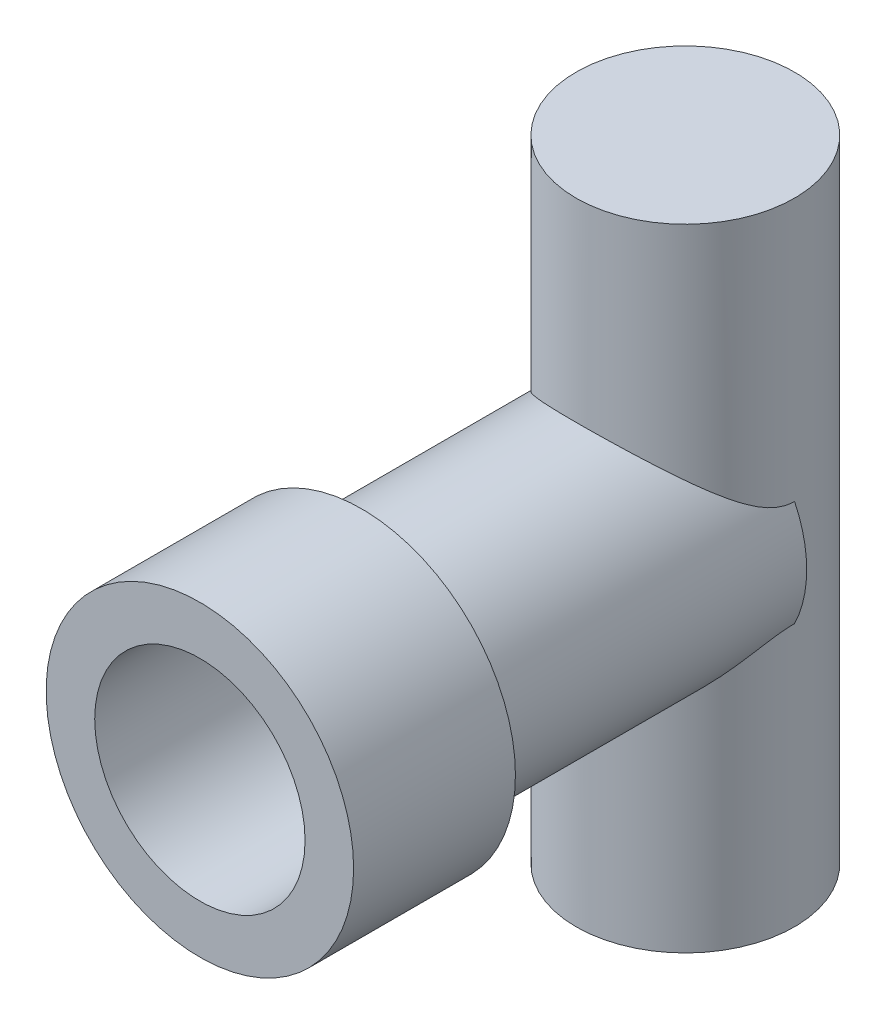
ISO-10303-21;
HEADER;
FILE_DESCRIPTION(('STEP AP214'),'2;1');
FILE_NAME('part.step','',(''),(''),'','','');
FILE_SCHEMA(('AUTOMOTIVE_DESIGN { 1 0 10303 214 1 1 1 1 }'));
ENDSEC;
DATA;
#1=APPLICATION_CONTEXT('core data for automotive mechanical design processes');
#2=APPLICATION_PROTOCOL_DEFINITION('international standard','automotive_design',2000,#1);
#3=PRODUCT_CONTEXT('',#1,'mechanical');
#4=PRODUCT('Part','Part','',(#3));
#5=PRODUCT_RELATED_PRODUCT_CATEGORY('part','',(#4));
#6=PRODUCT_DEFINITION_FORMATION('','',#4);
#7=PRODUCT_DEFINITION_CONTEXT('part definition',#1,'design');
#8=PRODUCT_DEFINITION('design','',#6,#7);
#9=PRODUCT_DEFINITION_SHAPE('','',#8);
#10=(LENGTH_UNIT() NAMED_UNIT(*) SI_UNIT(.MILLI.,.METRE.));
#11=(NAMED_UNIT(*) PLANE_ANGLE_UNIT() SI_UNIT($,.RADIAN.));
#12=(NAMED_UNIT(*) SI_UNIT($,.STERADIAN.) SOLID_ANGLE_UNIT());
#13=UNCERTAINTY_MEASURE_WITH_UNIT(LENGTH_MEASURE(1.E-05),#10,'distance_accuracy_value','');
#14=(GEOMETRIC_REPRESENTATION_CONTEXT(3) GLOBAL_UNCERTAINTY_ASSIGNED_CONTEXT((#13)) GLOBAL_UNIT_ASSIGNED_CONTEXT((#10,
#11,#12)) REPRESENTATION_CONTEXT('',''));
#15=CARTESIAN_POINT('',(0.,0.,0.));
#16=DIRECTION('',(0.,0.,1.));
#17=DIRECTION('',(1.,0.,0.));
#18=AXIS2_PLACEMENT_3D('',#15,#16,#17);
#19=CARTESIAN_POINT('',(0.,0.,-120.));
#20=DIRECTION('',(0.,0.,1.));
#21=DIRECTION('',(1.,0.,0.));
#22=AXIS2_PLACEMENT_3D('',#19,#20,#21);
#23=PLANE('',#22);
#24=CARTESIAN_POINT('',(0.,0.,-120.));
#25=DIRECTION('',(0.,0.,1.));
#26=DIRECTION('',(1.,0.,0.));
#27=AXIS2_PLACEMENT_3D('',#24,#25,#26);
#28=CIRCLE('',#27,30.);
#29=CARTESIAN_POINT('',(27.,-13.076696830622,-120.));
#30=VERTEX_POINT('',#29);
#31=CARTESIAN_POINT('',(27.,13.076696830622,-120.));
#32=VERTEX_POINT('',#31);
#33=EDGE_CURVE('E56',#30,#32,#28,.T.);
#34=ORIENTED_EDGE('',*,*,#33,.F.);
#35=DIRECTION('',(0.,1.,0.));
#36=VECTOR('',#35,1.);
#37=CARTESIAN_POINT('',(27.,-78.,-120.));
#38=LINE('',#37,#36);
#39=EDGE_CURVE('E68',#30,#32,#38,.T.);
#40=ORIENTED_EDGE('',*,*,#39,.T.);
#41=EDGE_LOOP('',(#34,#40));
#42=FACE_BOUND('',#41,.T.);
#43=ADVANCED_FACE('F41',(#42),#23,.F.);
#44=CARTESIAN_POINT('',(0.,0.,-120.));
#45=DIRECTION('',(0.,0.,1.));
#46=DIRECTION('',(1.,0.,0.));
#47=AXIS2_PLACEMENT_3D('',#44,#45,#46);
#48=CYLINDRICAL_SURFACE('',#47,30.);
#49=CARTESIAN_POINT('',(27.,-13.076696830622,-120.));
#50=CARTESIAN_POINT('',(27.0000043332582,-13.0766771037259,-119.794944084885));
#51=CARTESIAN_POINT('',(26.9976631699604,-13.0815228562129,-119.589927154216));
#52=CARTESIAN_POINT('',(26.9883361968455,-13.1007587950419,-119.180490646388));
#53=CARTESIAN_POINT('',(26.9813513944016,-13.1151469112987,-118.976070949325));
#54=CARTESIAN_POINT('',(26.953553802587,-13.1722367865661,-118.365546023172));
#55=CARTESIAN_POINT('',(26.9258972392371,-13.2288662861642,-117.960969869578));
#56=CARTESIAN_POINT('',(26.853873841607,-13.3744460899773,-117.167042035168));
#57=CARTESIAN_POINT('',(26.809819603579,-13.4627907398043,-116.777547300807));
#58=CARTESIAN_POINT('',(26.7060690038055,-13.6674445440046,-116.0079072041));
#59=CARTESIAN_POINT('',(26.6463609114351,-13.7837746646116,-115.62776908806));
#60=CARTESIAN_POINT('',(26.4794798499071,-14.1026010887795,-114.693373287573));
#61=CARTESIAN_POINT('',(26.3634131010073,-14.3193173864468,-114.145568376157));
#62=CARTESIAN_POINT('',(26.102272011065,-14.7899918759504,-113.073512794568));
#63=CARTESIAN_POINT('',(25.9571821619163,-15.0439699587006,-112.549274901318));
#64=CARTESIAN_POINT('',(25.6386290361448,-15.5807305030868,-111.517354542534));
#65=CARTESIAN_POINT('',(25.464883475244,-15.8637877427019,-111.009904097561));
#66=CARTESIAN_POINT('',(25.0916271509693,-16.4478082143847,-110.015396081265));
#67=CARTESIAN_POINT('',(24.8921188717145,-16.7487697185622,-109.528336549775));
#68=CARTESIAN_POINT('',(24.4992625322574,-17.3172601173498,-108.642844159889));
#69=CARTESIAN_POINT('',(24.3093001150917,-17.5832210666181,-108.241887322226));
#70=CARTESIAN_POINT('',(23.9114636135472,-18.1205314736212,-107.452600022354));
#71=CARTESIAN_POINT('',(23.7035873834649,-18.3918815738607,-107.064271080401));
#72=CARTESIAN_POINT('',(23.2699387065297,-18.9375685525377,-106.299515849596));
#73=CARTESIAN_POINT('',(23.04415636758,-19.2119070086612,-105.923096302899));
#74=CARTESIAN_POINT('',(22.5748044945102,-19.7612941668088,-105.182087382324));
#75=CARTESIAN_POINT('',(22.3312357139708,-20.0363428382666,-104.817497508188));
#76=CARTESIAN_POINT('',(21.8270001990366,-20.5844671303168,-104.101154338122));
#77=CARTESIAN_POINT('',(21.566389301464,-20.8575462310403,-103.749364472961));
#78=CARTESIAN_POINT('',(21.0272670589623,-21.4009492210221,-103.057557365305));
#79=CARTESIAN_POINT('',(20.7487538636138,-21.6712728221096,-102.717541345387));
#80=CARTESIAN_POINT('',(19.8864017087166,-22.4755040359264,-101.715928083255));
#81=CARTESIAN_POINT('',(19.275364074502,-23.0030971565014,-101.072215645619));
#82=CARTESIAN_POINT('',(18.1368792647169,-23.9049386374085,-99.9871745756483));
#83=CARTESIAN_POINT('',(17.6249986179506,-24.285393363087,-99.5345728992626));
#84=CARTESIAN_POINT('',(16.5587560267504,-25.0245540957934,-98.6626650102842));
#85=CARTESIAN_POINT('',(16.0043947751043,-25.3832604573299,-98.243358254934));
#86=CARTESIAN_POINT('',(14.8538835330437,-26.0731935664672,-97.4422348228602));
#87=CARTESIAN_POINT('',(14.2577771795092,-26.4044482414785,-97.0603799707746));
#88=CARTESIAN_POINT('',(13.3329623179748,-26.876606418852,-96.5189494039284));
#89=CARTESIAN_POINT('',(13.0195971632889,-27.0298651139578,-96.3437054495291));
#90=CARTESIAN_POINT('',(12.3827220929641,-27.3274911169221,-96.0041993560961));
#91=CARTESIAN_POINT('',(12.0592095919982,-27.4718561306308,-95.839940049656));
#92=CARTESIAN_POINT('',(11.2028187656869,-27.83569252806,-95.426836875774));
#93=CARTESIAN_POINT('',(10.6621490399455,-28.0475100220731,-95.1872313322194));
#94=CARTESIAN_POINT('',(9.557450802144,-28.4429120177961,-94.7411421489167));
#95=CARTESIAN_POINT('',(8.99342731958989,-28.6265025587821,-94.5346514237047));
#96=CARTESIAN_POINT('',(7.84460532378355,-28.962390960955,-94.1576429469956));
#97=CARTESIAN_POINT('',(7.25981505725037,-29.1147010844979,-93.9871110984186));
#98=CARTESIAN_POINT('',(6.07257507674099,-29.3852764652012,-93.6846233721833));
#99=CARTESIAN_POINT('',(5.4701251707219,-29.5035413519792,-93.5526679142022));
#100=CARTESIAN_POINT('',(4.24795196324874,-29.7042198818274,-93.3289831802071));
#101=CARTESIAN_POINT('',(3.62814536948088,-29.7864091444402,-93.2375056379687));
#102=CARTESIAN_POINT('',(2.37975742344233,-29.9120422930227,-93.0977470503086));
#103=CARTESIAN_POINT('',(1.75117604927103,-29.9554860822718,-93.0494661127191));
#104=CARTESIAN_POINT('',(0.490840915654156,-30.0026106189566,-92.9970969252665));
#105=CARTESIAN_POINT('',(-0.140911997761771,-30.0063014598764,-92.9929974574942));
#106=CARTESIAN_POINT('',(-1.40209404464455,-29.9738546949851,-93.0290521149359));
#107=CARTESIAN_POINT('',(-2.03152333333213,-29.9377197997145,-93.0692032284544));
#108=CARTESIAN_POINT('',(-3.22164551326188,-29.831903886755,-93.1868861812163));
#109=CARTESIAN_POINT('',(-3.78306639882548,-29.7658298120561,-93.2603998562034));
#110=CARTESIAN_POINT('',(-4.89581822914499,-29.6031600868794,-93.4415986651328));
#111=CARTESIAN_POINT('',(-5.44714996773707,-29.5065668487348,-93.549281098269));
#112=CARTESIAN_POINT('',(-6.53654183256456,-29.2845135198351,-93.7972182501543));
#113=CARTESIAN_POINT('',(-7.07460033343139,-29.159049913009,-93.9374769363268));
#114=CARTESIAN_POINT('',(-8.13466526660764,-28.8812657297797,-94.2486422988215));
#115=CARTESIAN_POINT('',(-8.65667072718238,-28.7289435312955,-94.4195508262017));
#116=CARTESIAN_POINT('',(-9.71064620103944,-28.3906025796599,-94.8001127226032));
#117=CARTESIAN_POINT('',(-10.241584547378,-28.2031910583811,-95.0113803330756));
#118=CARTESIAN_POINT('',(-11.2811918895987,-27.8036843628122,-95.4631707093907));
#119=CARTESIAN_POINT('',(-11.7898607143118,-27.5915889988416,-95.7036937000439));
#120=CARTESIAN_POINT('',(-12.7836263517606,-27.1454526952386,-96.2115505719714));
#121=CARTESIAN_POINT('',(-13.2687215239221,-26.9114102315407,-96.4788863152849));
#122=CARTESIAN_POINT('',(-14.214565642838,-26.4240275797917,-97.038117583659));
#123=CARTESIAN_POINT('',(-14.6753094163349,-26.170683318918,-97.3300182934763));
#124=CARTESIAN_POINT('',(-15.4656155671712,-25.7093682652703,-97.8643897806286));
#125=CARTESIAN_POINT('',(-15.8003944000333,-25.504868929346,-98.1021857814381));
#126=CARTESIAN_POINT('',(-16.4552936691472,-25.0873299473406,-98.5899559571754));
#127=CARTESIAN_POINT('',(-16.7754164751207,-24.8742916924325,-98.8399281497575));
#128=CARTESIAN_POINT('',(-17.7141557786844,-24.2237150146772,-99.6072986784636));
#129=CARTESIAN_POINT('',(-18.3109500753963,-23.7748285752008,-100.142019584737));
#130=CARTESIAN_POINT('',(-19.448428848825,-22.8538033148751,-101.254492053949));
#131=CARTESIAN_POINT('',(-19.9889050565,-22.3815870875355,-101.832390649256));
#132=CARTESIAN_POINT('',(-21.0123013858793,-21.4236759586739,-103.026450145454));
#133=CARTESIAN_POINT('',(-21.4952343310924,-20.9379840900522,-103.642602474777));
#134=CARTESIAN_POINT('',(-22.1825132057955,-20.2003180918146,-104.602087534201));
#135=CARTESIAN_POINT('',(-22.4078159916166,-19.9499368848129,-104.931847071037));
#136=CARTESIAN_POINT('',(-22.8436411228794,-19.449373122202,-105.601126797835));
#137=CARTESIAN_POINT('',(-23.0541646240139,-19.199190552576,-105.940646221672));
#138=CARTESIAN_POINT('',(-23.4606086865544,-18.7003591008528,-106.629883058585));
#139=CARTESIAN_POINT('',(-23.6565182291895,-18.4517115031167,-106.979607895492));
#140=CARTESIAN_POINT('',(-24.0334981240878,-17.9579347494809,-107.689337246313));
#141=CARTESIAN_POINT('',(-24.2145700088486,-17.7128052323814,-108.049340693416));
#142=CARTESIAN_POINT('',(-24.5611939531425,-17.2289298551864,-108.779020358577));
#143=CARTESIAN_POINT('',(-24.7267939320752,-16.9901660406005,-109.148661845453));
#144=CARTESIAN_POINT('',(-25.0428689296431,-16.5207375377999,-109.899472876267));
#145=CARTESIAN_POINT('',(-25.1933423468262,-16.2900737088107,-110.280643635266));
#146=CARTESIAN_POINT('',(-25.4785060241133,-15.8403446331411,-111.0548503995));
#147=CARTESIAN_POINT('',(-25.6132163202248,-15.6212648609328,-111.447870525894));
#148=CARTESIAN_POINT('',(-25.8663500375085,-15.1984406487902,-112.247091980788));
#149=CARTESIAN_POINT('',(-25.9847788516661,-14.9946911411191,-112.653288889318));
#150=CARTESIAN_POINT('',(-26.1917224215557,-14.6298487725643,-113.432144644812));
#151=CARTESIAN_POINT('',(-26.2821121714525,-14.466546779625,-113.803263290447));
#152=CARTESIAN_POINT('',(-26.4484907521253,-14.1600757132723,-114.556998081914));
#153=CARTESIAN_POINT('',(-26.5244786267559,-14.0169079767415,-114.939614989167));
#154=CARTESIAN_POINT('',(-26.6605481993931,-13.7563331316218,-115.714106263928));
#155=CARTESIAN_POINT('',(-26.7207110595372,-13.6387951285972,-116.105921704198));
#156=CARTESIAN_POINT('',(-26.8243538840058,-13.4338113250084,-116.899364552645));
#157=CARTESIAN_POINT('',(-26.8678442747114,-13.3463467211295,-117.300985660975));
#158=CARTESIAN_POINT('',(-26.9345216458512,-13.2112405499703,-118.083142284209));
#159=CARTESIAN_POINT('',(-26.9589304735186,-13.161213348089,-118.463151473635));
#160=CARTESIAN_POINT('',(-26.9834972693795,-13.1107280937451,-119.036758341452));
#161=CARTESIAN_POINT('',(-26.9896787098517,-13.0979913884919,-119.229086117689));
#162=CARTESIAN_POINT('',(-26.9979325032807,-13.0809664883741,-119.614265481187));
#163=CARTESIAN_POINT('',(-27.000003506717,-13.0766810682011,-119.807117219671));
#164=CARTESIAN_POINT('',(-27.,-13.076696830622,-120.));
#165=B_SPLINE_CURVE_WITH_KNOTS('',3,(#49,#50,#51,#52,#53,#54,#55,#56,#57,#58,#59,#60,#61,#62,
#63,#64,#65,#66,#67,#68,#69,#70,#71,#72,#73,#74,#75,#76,#77,#78,#79,#80,#81,#82,#83,#84,#85,#86,
#87,#88,#89,#90,#91,#92,#93,#94,#95,#96,#97,#98,#99,#100,#101,#102,#103,#104,#105,#106,#107,
#108,#109,#110,#111,#112,#113,#114,#115,#116,#117,#118,#119,#120,#121,#122,#123,#124,#125,#126,
#127,#128,#129,#130,#131,#132,#133,#134,#135,#136,#137,#138,#139,#140,#141,#142,#143,#144,#145,
#146,#147,#148,#149,#150,#151,#152,#153,#154,#155,#156,#157,#158,#159,#160,#161,#162,#163,#164),
.UNSPECIFIED.,.F.,.F.,(4,2,2,2,2,2,2,2,2,2,2,2,2,2,2,2,2,2,2,2,2,2,2,2,2,2,2,2,2,2,2,2,2,2,2,2,
2,2,2,2,2,2,2,2,2,2,2,2,2,2,2,2,2,2,2,2,2,4),(0.,0.615022816493971,1.22991225583417,
2.45609332500849,3.66000576954704,4.8648229889562,6.66302342212573,8.46218727872877,
10.2802678924319,12.0981733320249,13.6495395528148,15.2010918540798,16.7535073508763,
18.3058571126359,19.8533535208722,21.4010101396306,24.4939452465036,26.8382353718361,
29.1824872738443,31.5243242492524,32.6951309818597,33.8662384735279,35.7488194407566,
37.6309970596216,39.5124354245141,41.3938942570378,43.2868949213734,45.1799003112148,
47.0724250456285,48.9648209827231,50.6730492189997,52.3811424651625,54.0894438471716,
55.7978484346263,57.6002387003581,59.4026428172812,61.2051721907932,63.0080829704344,
64.383827598361,65.7593489918675,68.5111685242692,71.2728280461961,74.0338709770403,
75.44772518662,76.8614687138809,78.2762676347673,79.6909202444293,81.1010351156435,
82.511299119107,83.9197506478941,85.3277345193709,86.5732112300461,87.818770599392,
89.0578114628841,90.2960762044893,91.4464644489427,92.0248048385002,92.6033350748369),.UNSPECIFIED.);
#166=CARTESIAN_POINT('',(-27.,-13.076696830622,-120.));
#167=VERTEX_POINT('',#166);
#168=EDGE_CURVE('E63',#30,#167,#165,.T.);
#169=ORIENTED_EDGE('',*,*,#168,.F.);
#170=ORIENTED_EDGE('',*,*,#33,.T.);
#171=CARTESIAN_POINT('',(-27.,13.076696830622,-120.));
#172=CARTESIAN_POINT('',(-27.0000043332582,13.0766771037259,-119.794944084885));
#173=CARTESIAN_POINT('',(-26.9976631699604,13.0815228562129,-119.589927154216));
#174=CARTESIAN_POINT('',(-26.9883361968455,13.1007587950419,-119.180490646388));
#175=CARTESIAN_POINT('',(-26.9813513944016,13.1151469112987,-118.976070949325));
#176=CARTESIAN_POINT('',(-26.953553802587,13.1722367865661,-118.365546023172));
#177=CARTESIAN_POINT('',(-26.9258972392371,13.2288662861642,-117.960969869578));
#178=CARTESIAN_POINT('',(-26.853873841607,13.3744460899773,-117.167042035168));
#179=CARTESIAN_POINT('',(-26.809819603579,13.4627907398043,-116.777547300807));
#180=CARTESIAN_POINT('',(-26.7060690038055,13.6674445440046,-116.0079072041));
#181=CARTESIAN_POINT('',(-26.6463609114351,13.7837746646116,-115.62776908806));
#182=CARTESIAN_POINT('',(-26.4794798499071,14.1026010887795,-114.693373287573));
#183=CARTESIAN_POINT('',(-26.3634131010073,14.3193173864468,-114.145568376157));
#184=CARTESIAN_POINT('',(-26.102272011065,14.7899918759504,-113.073512794568));
#185=CARTESIAN_POINT('',(-25.9571821619163,15.0439699587006,-112.549274901318));
#186=CARTESIAN_POINT('',(-25.6386290361448,15.5807305030868,-111.517354542534));
#187=CARTESIAN_POINT('',(-25.464883475244,15.8637877427019,-111.009904097561));
#188=CARTESIAN_POINT('',(-25.0916271509693,16.4478082143847,-110.015396081265));
#189=CARTESIAN_POINT('',(-24.8921188717145,16.7487697185622,-109.528336549775));
#190=CARTESIAN_POINT('',(-24.4992625322574,17.3172601173498,-108.642844159889));
#191=CARTESIAN_POINT('',(-24.3093001150917,17.5832210666181,-108.241887322226));
#192=CARTESIAN_POINT('',(-23.9114636135472,18.1205314736212,-107.452600022354));
#193=CARTESIAN_POINT('',(-23.7035873834649,18.3918815738607,-107.064271080401));
#194=CARTESIAN_POINT('',(-23.2699387065297,18.9375685525377,-106.299515849596));
#195=CARTESIAN_POINT('',(-23.04415636758,19.2119070086612,-105.923096302899));
#196=CARTESIAN_POINT('',(-22.5748044945102,19.7612941668088,-105.182087382324));
#197=CARTESIAN_POINT('',(-22.3312357139708,20.0363428382666,-104.817497508188));
#198=CARTESIAN_POINT('',(-21.8270001990366,20.5844671303168,-104.101154338122));
#199=CARTESIAN_POINT('',(-21.566389301464,20.8575462310403,-103.749364472961));
#200=CARTESIAN_POINT('',(-21.0272670589623,21.4009492210221,-103.057557365305));
#201=CARTESIAN_POINT('',(-20.7487538636138,21.6712728221096,-102.717541345387));
#202=CARTESIAN_POINT('',(-19.8864017087166,22.4755040359264,-101.715928083255));
#203=CARTESIAN_POINT('',(-19.275364074502,23.0030971565014,-101.072215645619));
#204=CARTESIAN_POINT('',(-18.1368792647169,23.9049386374085,-99.9871745756483));
#205=CARTESIAN_POINT('',(-17.6249986179506,24.285393363087,-99.5345728992626));
#206=CARTESIAN_POINT('',(-16.5587560267504,25.0245540957934,-98.6626650102842));
#207=CARTESIAN_POINT('',(-16.0043947751043,25.3832604573299,-98.243358254934));
#208=CARTESIAN_POINT('',(-14.8538835330437,26.0731935664672,-97.4422348228602));
#209=CARTESIAN_POINT('',(-14.2577771795092,26.4044482414785,-97.0603799707746));
#210=CARTESIAN_POINT('',(-13.3329623179748,26.876606418852,-96.5189494039284));
#211=CARTESIAN_POINT('',(-13.0195971632889,27.0298651139578,-96.3437054495291));
#212=CARTESIAN_POINT('',(-12.3827220929641,27.3274911169221,-96.0041993560961));
#213=CARTESIAN_POINT('',(-12.0592095919982,27.4718561306308,-95.839940049656));
#214=CARTESIAN_POINT('',(-11.2028187656869,27.83569252806,-95.426836875774));
#215=CARTESIAN_POINT('',(-10.6621490399455,28.0475100220731,-95.1872313322194));
#216=CARTESIAN_POINT('',(-9.557450802144,28.4429120177961,-94.7411421489167));
#217=CARTESIAN_POINT('',(-8.99342731958989,28.6265025587821,-94.5346514237047));
#218=CARTESIAN_POINT('',(-7.84460532378355,28.962390960955,-94.1576429469956));
#219=CARTESIAN_POINT('',(-7.25981505725037,29.1147010844979,-93.9871110984186));
#220=CARTESIAN_POINT('',(-6.07257507674099,29.3852764652012,-93.6846233721833));
#221=CARTESIAN_POINT('',(-5.4701251707219,29.5035413519792,-93.5526679142022));
#222=CARTESIAN_POINT('',(-4.24795196324874,29.7042198818274,-93.3289831802071));
#223=CARTESIAN_POINT('',(-3.62814536948088,29.7864091444402,-93.2375056379687));
#224=CARTESIAN_POINT('',(-2.37975742344233,29.9120422930227,-93.0977470503086));
#225=CARTESIAN_POINT('',(-1.75117604927103,29.9554860822718,-93.0494661127191));
#226=CARTESIAN_POINT('',(-0.490840915654156,30.0026106189566,-92.9970969252665));
#227=CARTESIAN_POINT('',(0.140911997761771,30.0063014598764,-92.9929974574942));
#228=CARTESIAN_POINT('',(1.40209404464455,29.9738546949851,-93.0290521149359));
#229=CARTESIAN_POINT('',(2.03152333333213,29.9377197997145,-93.0692032284544));
#230=CARTESIAN_POINT('',(3.22164551326188,29.831903886755,-93.1868861812163));
#231=CARTESIAN_POINT('',(3.78306639882548,29.7658298120561,-93.2603998562034));
#232=CARTESIAN_POINT('',(4.89581822914499,29.6031600868794,-93.4415986651328));
#233=CARTESIAN_POINT('',(5.44714996773707,29.5065668487348,-93.549281098269));
#234=CARTESIAN_POINT('',(6.53654183256456,29.2845135198351,-93.7972182501543));
#235=CARTESIAN_POINT('',(7.07460033343139,29.159049913009,-93.9374769363268));
#236=CARTESIAN_POINT('',(8.13466526660764,28.8812657297797,-94.2486422988215));
#237=CARTESIAN_POINT('',(8.65667072718238,28.7289435312955,-94.4195508262017));
#238=CARTESIAN_POINT('',(9.71064620103944,28.3906025796599,-94.8001127226032));
#239=CARTESIAN_POINT('',(10.241584547378,28.2031910583811,-95.0113803330756));
#240=CARTESIAN_POINT('',(11.2811918895987,27.8036843628122,-95.4631707093907));
#241=CARTESIAN_POINT('',(11.7898607143118,27.5915889988416,-95.7036937000439));
#242=CARTESIAN_POINT('',(12.7836263517606,27.1454526952386,-96.2115505719714));
#243=CARTESIAN_POINT('',(13.2687215239221,26.9114102315407,-96.4788863152849));
#244=CARTESIAN_POINT('',(14.214565642838,26.4240275797917,-97.038117583659));
#245=CARTESIAN_POINT('',(14.6753094163349,26.170683318918,-97.3300182934763));
#246=CARTESIAN_POINT('',(15.4656155671712,25.7093682652703,-97.8643897806286));
#247=CARTESIAN_POINT('',(15.8003944000333,25.504868929346,-98.1021857814381));
#248=CARTESIAN_POINT('',(16.4552936691472,25.0873299473406,-98.5899559571754));
#249=CARTESIAN_POINT('',(16.7754164751207,24.8742916924325,-98.8399281497575));
#250=CARTESIAN_POINT('',(17.7141557786844,24.2237150146772,-99.6072986784636));
#251=CARTESIAN_POINT('',(18.3109500753963,23.7748285752008,-100.142019584737));
#252=CARTESIAN_POINT('',(19.448428848825,22.8538033148751,-101.254492053949));
#253=CARTESIAN_POINT('',(19.9889050565,22.3815870875355,-101.832390649256));
#254=CARTESIAN_POINT('',(21.0123013858793,21.4236759586739,-103.026450145454));
#255=CARTESIAN_POINT('',(21.4952343310924,20.9379840900522,-103.642602474777));
#256=CARTESIAN_POINT('',(22.1825132057955,20.2003180918146,-104.602087534201));
#257=CARTESIAN_POINT('',(22.4078159916166,19.9499368848129,-104.931847071037));
#258=CARTESIAN_POINT('',(22.8436411228794,19.449373122202,-105.601126797835));
#259=CARTESIAN_POINT('',(23.0541646240139,19.199190552576,-105.940646221672));
#260=CARTESIAN_POINT('',(23.4606086865544,18.7003591008528,-106.629883058585));
#261=CARTESIAN_POINT('',(23.6565182291895,18.4517115031167,-106.979607895492));
#262=CARTESIAN_POINT('',(24.0334981240878,17.9579347494809,-107.689337246313));
#263=CARTESIAN_POINT('',(24.2145700088486,17.7128052323814,-108.049340693416));
#264=CARTESIAN_POINT('',(24.5611939531425,17.2289298551864,-108.779020358577));
#265=CARTESIAN_POINT('',(24.7267939320752,16.9901660406005,-109.148661845453));
#266=CARTESIAN_POINT('',(25.0428689296431,16.5207375377999,-109.899472876267));
#267=CARTESIAN_POINT('',(25.1933423468262,16.2900737088107,-110.280643635266));
#268=CARTESIAN_POINT('',(25.4785060241133,15.8403446331411,-111.0548503995));
#269=CARTESIAN_POINT('',(25.6132163202248,15.6212648609328,-111.447870525894));
#270=CARTESIAN_POINT('',(25.8663500375085,15.1984406487902,-112.247091980788));
#271=CARTESIAN_POINT('',(25.9847788516661,14.9946911411191,-112.653288889318));
#272=CARTESIAN_POINT('',(26.1917224215557,14.6298487725643,-113.432144644812));
#273=CARTESIAN_POINT('',(26.2821121714525,14.466546779625,-113.803263290447));
#274=CARTESIAN_POINT('',(26.4484907521253,14.1600757132723,-114.556998081914));
#275=CARTESIAN_POINT('',(26.5244786267559,14.0169079767415,-114.939614989167));
#276=CARTESIAN_POINT('',(26.6605481993931,13.7563331316218,-115.714106263928));
#277=CARTESIAN_POINT('',(26.7207110595372,13.6387951285972,-116.105921704198));
#278=CARTESIAN_POINT('',(26.8243538840058,13.4338113250084,-116.899364552645));
#279=CARTESIAN_POINT('',(26.8678442747114,13.3463467211295,-117.300985660975));
#280=CARTESIAN_POINT('',(26.9345216458512,13.2112405499703,-118.083142284209));
#281=CARTESIAN_POINT('',(26.9589304735186,13.161213348089,-118.463151473635));
#282=CARTESIAN_POINT('',(26.9834972693795,13.1107280937451,-119.036758341452));
#283=CARTESIAN_POINT('',(26.9896787098517,13.0979913884919,-119.229086117689));
#284=CARTESIAN_POINT('',(26.9979325032807,13.0809664883741,-119.614265481187));
#285=CARTESIAN_POINT('',(27.000003506717,13.0766810682011,-119.807117219671));
#286=CARTESIAN_POINT('',(27.,13.076696830622,-120.));
#287=B_SPLINE_CURVE_WITH_KNOTS('',3,(#171,#172,#173,#174,#175,#176,#177,#178,#179,#180,#181,
#182,#183,#184,#185,#186,#187,#188,#189,#190,#191,#192,#193,#194,#195,#196,#197,#198,#199,#200,
#201,#202,#203,#204,#205,#206,#207,#208,#209,#210,#211,#212,#213,#214,#215,#216,#217,#218,#219,
#220,#221,#222,#223,#224,#225,#226,#227,#228,#229,#230,#231,#232,#233,#234,#235,#236,#237,#238,
#239,#240,#241,#242,#243,#244,#245,#246,#247,#248,#249,#250,#251,#252,#253,#254,#255,#256,#257,
#258,#259,#260,#261,#262,#263,#264,#265,#266,#267,#268,#269,#270,#271,#272,#273,#274,#275,#276,
#277,#278,#279,#280,#281,#282,#283,#284,#285,#286),.UNSPECIFIED.,.F.,.F.,(4,2,2,2,2,2,2,2,2,2,2,
2,2,2,2,2,2,2,2,2,2,2,2,2,2,2,2,2,2,2,2,2,2,2,2,2,2,2,2,2,2,2,2,2,2,2,2,2,2,2,2,2,2,2,2,2,2,4),
(0.,0.615022816493971,1.22991225583417,2.45609332500849,3.66000576954704,4.8648229889562,
6.66302342212573,8.46218727872877,10.2802678924319,12.0981733320249,13.6495395528148,
15.2010918540798,16.7535073508763,18.3058571126359,19.8533535208722,21.4010101396306,
24.4939452465036,26.8382353718361,29.1824872738443,31.5243242492524,32.6951309818597,
33.8662384735279,35.7488194407566,37.6309970596216,39.5124354245141,41.3938942570378,
43.2868949213734,45.1799003112148,47.0724250456285,48.9648209827231,50.6730492189997,
52.3811424651625,54.0894438471716,55.7978484346263,57.6002387003581,59.4026428172812,
61.2051721907932,63.0080829704344,64.383827598361,65.7593489918675,68.5111685242692,
71.2728280461961,74.0338709770403,75.44772518662,76.8614687138809,78.2762676347673,
79.6909202444293,81.1010351156435,82.511299119107,83.9197506478941,85.3277345193709,
86.5732112300461,87.818770599392,89.0578114628841,90.2960762044893,91.4464644489427,
92.0248048385002,92.6033350748369),.UNSPECIFIED.);
#288=CARTESIAN_POINT('',(-27.,13.076696830622,-120.));
#289=VERTEX_POINT('',#288);
#290=EDGE_CURVE('E75',#289,#32,#287,.T.);
#291=ORIENTED_EDGE('',*,*,#290,.F.);
#292=EDGE_CURVE('E11',#289,#167,#28,.T.);
#293=ORIENTED_EDGE('',*,*,#292,.T.);
#294=EDGE_LOOP('',(#169,#170,#291,#293));
#295=FACE_BOUND('',#294,.T.);
#296=CARTESIAN_POINT('',(0.,0.,-40.));
#297=DIRECTION('',(0.,0.,1.));
#298=DIRECTION('',(1.,0.,0.));
#299=AXIS2_PLACEMENT_3D('',#296,#297,#298);
#300=CIRCLE('',#299,30.);
#301=CARTESIAN_POINT('',(30.,0.,-40.));
#302=VERTEX_POINT('',#301);
#303=EDGE_CURVE('E108',#302,#302,#300,.T.);
#304=ORIENTED_EDGE('',*,*,#303,.F.);
#305=EDGE_LOOP('',(#304));
#306=FACE_BOUND('',#305,.T.);
#307=ADVANCED_FACE('F43',(#295,#306),#48,.T.);
#308=ORIENTED_EDGE('',*,*,#292,.F.);
#309=DIRECTION('',(0.,1.,0.));
#310=VECTOR('',#309,1.);
#311=CARTESIAN_POINT('',(-27.,-78.,-120.));
#312=LINE('',#311,#310);
#313=EDGE_CURVE('E72',#289,#167,#312,.F.);
#314=ORIENTED_EDGE('',*,*,#313,.T.);
#315=EDGE_LOOP('',(#308,#314));
#316=FACE_BOUND('',#315,.T.);
#317=ADVANCED_FACE('F84',(#316),#23,.F.);
#318=CARTESIAN_POINT('',(0.,0.,0.));
#319=DIRECTION('',(0.,0.,1.));
#320=DIRECTION('',(1.,0.,0.));
#321=AXIS2_PLACEMENT_3D('',#318,#319,#320);
#322=PLANE('',#321);
#323=CARTESIAN_POINT('',(0.,0.,0.));
#324=DIRECTION('',(0.,0.,1.));
#325=DIRECTION('',(1.,0.,0.));
#326=AXIS2_PLACEMENT_3D('',#323,#324,#325);
#327=CIRCLE('',#326,26.);
#328=CARTESIAN_POINT('',(26.,0.,0.));
#329=VERTEX_POINT('',#328);
#330=EDGE_CURVE('E100',#329,#329,#327,.T.);
#331=ORIENTED_EDGE('',*,*,#330,.F.);
#332=EDGE_LOOP('',(#331));
#333=FACE_BOUND('',#332,.T.);
#334=CARTESIAN_POINT('',(0.,0.,0.));
#335=DIRECTION('',(0.,0.,1.));
#336=DIRECTION('',(1.,0.,0.));
#337=AXIS2_PLACEMENT_3D('',#334,#335,#336);
#338=CIRCLE('',#337,38.);
#339=CARTESIAN_POINT('',(38.,0.,0.));
#340=VERTEX_POINT('',#339);
#341=EDGE_CURVE('E105',#340,#340,#338,.T.);
#342=ORIENTED_EDGE('',*,*,#341,.T.);
#343=EDGE_LOOP('',(#342));
#344=FACE_BOUND('',#343,.T.);
#345=ADVANCED_FACE('F86',(#333,#344),#322,.T.);
#346=CARTESIAN_POINT('',(0.,0.,-120.));
#347=DIRECTION('',(0.,0.,1.));
#348=DIRECTION('',(1.,0.,0.));
#349=AXIS2_PLACEMENT_3D('',#346,#347,#348);
#350=CYLINDRICAL_SURFACE('',#349,26.);
#351=CARTESIAN_POINT('',(26.,0.,-112.71989011072));
#352=CARTESIAN_POINT('',(25.9999998770491,-0.238250820727438,-112.719888657265));
#353=CARTESIAN_POINT('',(25.9967139502656,-0.476512188532624,-112.708123506511));
#354=CARTESIAN_POINT('',(25.9836983372341,-0.950631263723705,-112.661882015908));
#355=CARTESIAN_POINT('',(25.973967559003,-1.18648855689772,-112.627401827343));
#356=CARTESIAN_POINT('',(25.9483562036376,-1.65469006543348,-112.537764337782));
#357=CARTESIAN_POINT('',(25.9324542674807,-1.88701913487722,-112.482535244087));
#358=CARTESIAN_POINT('',(25.8949421989874,-2.34629818853962,-112.354319450736));
#359=CARTESIAN_POINT('',(25.873328951855,-2.57324516368443,-112.281323062994));
#360=CARTESIAN_POINT('',(25.809397053005,-3.16404434667209,-112.069440922665));
#361=CARTESIAN_POINT('',(25.7626607848251,-3.52297836273148,-111.918210223543));
#362=CARTESIAN_POINT('',(25.6567405366553,-4.22590337038676,-111.587997980663));
#363=CARTESIAN_POINT('',(25.5975453311725,-4.56988054634559,-111.408991449383));
#364=CARTESIAN_POINT('',(25.4676017446302,-5.24596150510373,-111.031089563864));
#365=CARTESIAN_POINT('',(25.3968135333487,-5.57801936436804,-110.832126592077));
#366=CARTESIAN_POINT('',(25.2445529208412,-6.23096042635307,-110.420820208511));
#367=CARTESIAN_POINT('',(25.1630838307697,-6.55184705338541,-110.208480954038));
#368=CARTESIAN_POINT('',(24.9736085928898,-7.243654561488,-109.733752974956));
#369=CARTESIAN_POINT('',(24.8634910037435,-7.61267378143299,-109.469445831673));
#370=CARTESIAN_POINT('',(24.6290870036978,-8.33990350738634,-108.932296779788));
#371=CARTESIAN_POINT('',(24.5047975700363,-8.6981116867874,-108.659453059429));
#372=CARTESIAN_POINT('',(24.2421119604159,-9.40544628591239,-108.108267428702));
#373=CARTESIAN_POINT('',(24.103705295158,-9.75456570722748,-107.829921555787));
#374=CARTESIAN_POINT('',(23.8128641922963,-10.4445028003591,-107.270231685709));
#375=CARTESIAN_POINT('',(23.6604284518816,-10.7853196974369,-106.988887412248));
#376=CARTESIAN_POINT('',(23.3414968923213,-11.4592080329142,-106.425044545631));
#377=CARTESIAN_POINT('',(23.1750038939204,-11.7922810081907,-106.142546194829));
#378=CARTESIAN_POINT('',(22.8277999356656,-12.4511106649071,-105.577743060009));
#379=CARTESIAN_POINT('',(22.6470880955748,-12.7768668917862,-105.295438289068));
#380=CARTESIAN_POINT('',(22.0835562107267,-13.7431003871222,-104.450907521499));
#381=CARTESIAN_POINT('',(21.6791467899445,-14.3729505774746,-103.890720109106));
#382=CARTESIAN_POINT('',(20.8260993067387,-15.5820948974801,-102.803054901238));
#383=CARTESIAN_POINT('',(20.3794657396249,-16.1623832613988,-102.275115161955));
#384=CARTESIAN_POINT('',(19.6669497854319,-17.0102112958648,-101.497711452183));
#385=CARTESIAN_POINT('',(19.4223269532987,-17.2890766128333,-101.240972721642));
#386=CARTESIAN_POINT('',(18.9185710863796,-17.8389113389793,-100.733042247954));
#387=CARTESIAN_POINT('',(18.6594325753103,-18.1098777087286,-100.481852648827));
#388=CARTESIAN_POINT('',(17.8609566422925,-18.9090688775364,-99.7388472982401));
#389=CARTESIAN_POINT('',(17.2996886963655,-19.4246266830342,-99.2566378886175));
#390=CARTESIAN_POINT('',(16.1177887622878,-20.4159581592374,-98.3255333069151));
#391=CARTESIAN_POINT('',(15.4971814458293,-20.8917482114073,-97.8766244260609));
#392=CARTESIAN_POINT('',(14.3729849390816,-21.6737246924082,-97.1365122243349));
#393=CARTESIAN_POINT('',(13.8833927196685,-21.9908784626319,-96.8355901564925));
#394=CARTESIAN_POINT('',(12.8728677824642,-22.5972648487627,-96.259159348933));
#395=CARTESIAN_POINT('',(12.3519374770703,-22.8864996094145,-95.9836486571806));
#396=CARTESIAN_POINT('',(11.2802270996456,-23.4332672050464,-95.4620436273339));
#397=CARTESIAN_POINT('',(10.7294747952983,-23.6908288243727,-95.2159225860967));
#398=CARTESIAN_POINT('',(9.59952541847079,-24.1707606850288,-94.7567673686218));
#399=CARTESIAN_POINT('',(9.02033246282416,-24.3931360000754,-94.5437284221679));
#400=CARTESIAN_POINT('',(7.92603880204099,-24.7681236656111,-94.1841605047849));
#401=CARTESIAN_POINT('',(7.41451072699259,-24.9262008499645,-94.032445194507));
#402=CARTESIAN_POINT('',(6.37542655594639,-25.2119844956637,-93.7579998394437));
#403=CARTESIAN_POINT('',(5.84787201615926,-25.3396938952359,-93.6352669904766));
#404=CARTESIAN_POINT('',(4.77994440322973,-25.5626588827847,-93.420899389093));
#405=CARTESIAN_POINT('',(4.23957678474909,-25.6579280247241,-93.3292516489753));
#406=CARTESIAN_POINT('',(3.14939367329736,-25.8144248996358,-93.1786637443291));
#407=CARTESIAN_POINT('',(2.5995780768732,-25.8756522596137,-93.1197239381802));
#408=CARTESIAN_POINT('',(1.49279248209553,-25.9630640270629,-93.0355687430342));
#409=CARTESIAN_POINT('',(0.935805151599843,-25.9891350037937,-93.0104625169707));
#410=CARTESIAN_POINT('',(-0.179181587697593,-26.0053600969624,-92.9948384767144));
#411=CARTESIAN_POINT('',(-0.737180997690041,-25.9955141711171,-93.0043207032411));
#412=CARTESIAN_POINT('',(-1.84977646991699,-25.9400964550725,-93.0576810847657));
#413=CARTESIAN_POINT('',(-2.40437227865105,-25.8945220355914,-93.1015617711675));
#414=CARTESIAN_POINT('',(-3.50585532841533,-25.7685131988279,-93.2228459206626));
#415=CARTESIAN_POINT('',(-4.05274265278264,-25.6880791587149,-93.3002490210547));
#416=CARTESIAN_POINT('',(-5.10874525550209,-25.4985190778574,-93.4825748309436));
#417=CARTESIAN_POINT('',(-5.618407934049,-25.3909693101607,-93.5859850774929));
#418=CARTESIAN_POINT('',(-6.62436837838188,-25.1472778711818,-93.8201518949404));
#419=CARTESIAN_POINT('',(-7.12066697240007,-25.0111379763804,-93.9509067667464));
#420=CARTESIAN_POINT('',(-8.09766073570841,-24.7121211865925,-94.237873388663));
#421=CARTESIAN_POINT('',(-8.57835322201516,-24.5492397230767,-94.3940894885363));
#422=CARTESIAN_POINT('',(-9.52227417786762,-24.1987580591804,-94.7299113784718));
#423=CARTESIAN_POINT('',(-9.98549910418107,-24.011152878004,-94.9095218814433));
#424=CARTESIAN_POINT('',(-11.067776210777,-23.5366742820176,-95.3632687020782));
#425=CARTESIAN_POINT('',(-11.6781996001907,-23.2393815523786,-95.647183238555));
#426=CARTESIAN_POINT('',(-12.8605607649595,-22.606547819372,-96.2503299238751));
#427=CARTESIAN_POINT('',(-13.4324864580893,-22.2709948965063,-96.5695730780027));
#428=CARTESIAN_POINT('',(-14.5376499952054,-21.5658784871144,-97.2387451173273));
#429=CARTESIAN_POINT('',(-15.0708183086022,-21.196256448944,-97.5887267796106));
#430=CARTESIAN_POINT('',(-16.0971045299652,-20.4277821097179,-98.31410113491));
#431=CARTESIAN_POINT('',(-16.5902217666195,-20.0289293189272,-98.6894942536641));
#432=CARTESIAN_POINT('',(-17.7084823372929,-19.0562428175792,-99.6014195966176));
#433=CARTESIAN_POINT('',(-18.316682726856,-18.4713921559549,-100.147033913935));
#434=CARTESIAN_POINT('',(-19.4614310222752,-17.2611437455835,-101.267811921623));
#435=CARTESIAN_POINT('',(-19.9979468523648,-16.6357280304035,-101.842988681589));
#436=CARTESIAN_POINT('',(-21.0018626997534,-15.348887290821,-103.014222351985));
#437=CARTESIAN_POINT('',(-21.4692126365167,-14.6874366443294,-103.610294009148));
#438=CARTESIAN_POINT('',(-22.1195414870636,-13.6706808374461,-104.512476172957));
#439=CARTESIAN_POINT('',(-22.3278528672119,-13.3276958097907,-104.814523309595));
#440=CARTESIAN_POINT('',(-22.7278881462563,-12.6334328584456,-105.420057127809));
#441=CARTESIAN_POINT('',(-22.9196129644243,-12.2821553957203,-105.723543728622));
#442=CARTESIAN_POINT('',(-23.3316968809695,-11.4839130067145,-106.404896208027));
#443=CARTESIAN_POINT('',(-23.5475494851436,-11.0346060166811,-106.782752732729));
#444=CARTESIAN_POINT('',(-23.9541407770963,-10.1217032610844,-107.534774211713));
#445=CARTESIAN_POINT('',(-24.1448774402136,-9.6581063472862,-107.908938866137));
#446=CARTESIAN_POINT('',(-24.5009429099566,-8.71535719221964,-108.647849655798));
#447=CARTESIAN_POINT('',(-24.6663191857149,-8.23623609742235,-109.012612297499));
#448=CARTESIAN_POINT('',(-24.8953066235442,-7.50260926287877,-109.547180028397));
#449=CARTESIAN_POINT('',(-24.9684471516375,-7.25561261184301,-109.723248884837));
#450=CARTESIAN_POINT('',(-25.1082646199238,-6.75591614652596,-110.069748908489));
#451=CARTESIAN_POINT('',(-25.1749422751665,-6.50321696699291,-110.240180698005));
#452=CARTESIAN_POINT('',(-25.2981647366611,-6.00540734012308,-110.564362431806));
#453=CARTESIAN_POINT('',(-25.3550656889781,-5.76064784948858,-110.718513915099));
#454=CARTESIAN_POINT('',(-25.4627037919628,-5.26451904207254,-111.018016945064));
#455=CARTESIAN_POINT('',(-25.5134421707922,-5.01315105450984,-111.163370242254));
#456=CARTESIAN_POINT('',(-25.6084519898459,-4.50272711848834,-111.442609595016));
#457=CARTESIAN_POINT('',(-25.6527212010122,-4.24366855693495,-111.576491691456));
#458=CARTESIAN_POINT('',(-25.7342753105029,-3.71727293857174,-111.829033637492));
#459=CARTESIAN_POINT('',(-25.7715617516218,-3.44993772567736,-111.947696847765));
#460=CARTESIAN_POINT('',(-25.8569975097482,-2.75604964982101,-112.225244721883));
#461=CARTESIAN_POINT('',(-25.8998213232821,-2.32288966610868,-112.370292853549));
#462=CARTESIAN_POINT('',(-25.9479128667641,-1.65978267572033,-112.53614245036));
#463=CARTESIAN_POINT('',(-25.9612462259857,-1.43679901343955,-112.582779745168));
#464=CARTESIAN_POINT('',(-25.9822153713892,-0.987411658939771,-112.656569948579));
#465=CARTESIAN_POINT('',(-25.9898543840966,-0.761009977750684,-112.68373389082));
#466=CARTESIAN_POINT('',(-25.999232133145,-0.304301211372811,-112.717126289808));
#467=CARTESIAN_POINT('',(-26.0009126134304,-0.0739775709882328,-112.723148035572));
#468=CARTESIAN_POINT('',(-25.99815030907,0.386155696232923,-112.713285945701));
#469=CARTESIAN_POINT('',(-25.9937074932328,0.615965320445197,-112.697401998481));
#470=CARTESIAN_POINT('',(-25.9788442594763,1.07337318074878,-112.644703737876));
#471=CARTESIAN_POINT('',(-25.9684126017578,1.3009664381036,-112.607850069887));
#472=CARTESIAN_POINT('',(-25.9418896698732,1.75198592324753,-112.515304895987));
#473=CARTESIAN_POINT('',(-25.9257957877702,1.97541018083833,-112.459604710102));
#474=CARTESIAN_POINT('',(-25.8804529023973,2.51027055665001,-112.305128365199));
#475=CARTESIAN_POINT('',(-25.8485183953757,2.81908439978321,-112.19809248184));
#476=CARTESIAN_POINT('',(-25.7751499689178,3.425662580713,-111.959026947672));
#477=CARTESIAN_POINT('',(-25.7337100004455,3.7234197415191,-111.826981390704));
#478=CARTESIAN_POINT('',(-25.6420403598694,4.30977865467971,-111.543758995939));
#479=CARTESIAN_POINT('',(-25.5917737583254,4.59833567220843,-111.39250254868));
#480=CARTESIAN_POINT('',(-25.4832286957252,5.16609592067973,-111.076264628241));
#481=CARTESIAN_POINT('',(-25.4249518639332,5.44530103945287,-110.911285948821));
#482=CARTESIAN_POINT('',(-25.2707915361066,6.12882212707385,-110.489006273114));
#483=CARTESIAN_POINT('',(-25.170350017797,6.52834878523287,-110.22563951203));
#484=CARTESIAN_POINT('',(-24.9535692500841,7.31335331917755,-109.684743333019));
#485=CARTESIAN_POINT('',(-24.8372228737214,7.69882479819575,-109.407207601113));
#486=CARTESIAN_POINT('',(-24.5888552041425,8.45861330547264,-108.84278536096));
#487=CARTESIAN_POINT('',(-24.4568103687865,8.83291250038168,-108.55588528904));
#488=CARTESIAN_POINT('',(-24.1773596628372,9.57136703876269,-107.976743632702));
#489=CARTESIAN_POINT('',(-24.0299563854988,9.93552408160831,-107.684502956887));
#490=CARTESIAN_POINT('',(-23.719389783552,10.6557347726762,-107.096457783274));
#491=CARTESIAN_POINT('',(-23.5561891956441,11.011766686402,-106.800646374328));
#492=CARTESIAN_POINT('',(-23.2142239309607,11.7154957086226,-106.208087334927));
#493=CARTESIAN_POINT('',(-23.0354587127826,12.0631925266513,-105.911339672252));
#494=CARTESIAN_POINT('',(-22.6623521147458,12.750313587798,-105.318709238842));
#495=CARTESIAN_POINT('',(-22.4680236590481,13.0897443959265,-105.022825957679));
#496=CARTESIAN_POINT('',(-22.0634556092155,13.7607184339357,-104.432987129038));
#497=CARTESIAN_POINT('',(-21.853214782136,14.0922610499909,-104.139031732861));
#498=CARTESIAN_POINT('',(-21.1790533318383,15.1037597518315,-103.236112830414));
#499=CARTESIAN_POINT('',(-20.68791941866,15.7704763535906,-102.632259422796));
#500=CARTESIAN_POINT('',(-19.6326611703207,17.0662527927651,-101.447679587895));
#501=CARTESIAN_POINT('',(-19.0685086064976,17.6952979282833,-100.866962219041));
#502=CARTESIAN_POINT('',(-17.8668382313209,18.9077096918317,-99.7403967703416));
#503=CARTESIAN_POINT('',(-17.2295919248387,19.491232651816,-99.1944306560151));
#504=CARTESIAN_POINT('',(-16.2168293310905,20.327467742032,-98.4084041454251));
#505=CARTESIAN_POINT('',(-15.8698455451833,20.5996467075992,-98.1519373621515));
#506=CARTESIAN_POINT('',(-15.1566171151683,21.1299424922988,-97.6512458431735));
#507=CARTESIAN_POINT('',(-14.7903686366801,21.3880564910138,-97.4070235636119));
#508=CARTESIAN_POINT('',(-13.9433696109017,21.952287196102,-96.8722482913936));
#509=CARTESIAN_POINT('',(-13.4571370312354,22.2539759542851,-96.5856537590514));
#510=CARTESIAN_POINT('',(-12.4552319625952,22.8298252738361,-96.0376733610018));
#511=CARTESIAN_POINT('',(-11.9395684578253,23.1039941662724,-95.7762798671554));
#512=CARTESIAN_POINT('',(-10.8797921507,23.6215532508545,-95.2821551657346));
#513=CARTESIAN_POINT('',(-10.3356815005003,23.8649457666242,-95.0494217943489));
#514=CARTESIAN_POINT('',(-9.22085511305444,24.3174356157844,-94.6162770216681));
#515=CARTESIAN_POINT('',(-8.65013855230906,24.5265318867404,-94.4158666216823));
#516=CARTESIAN_POINT('',(-7.47922656574705,24.9087148044238,-94.0492557213481));
#517=CARTESIAN_POINT('',(-6.8787964398553,25.0814271167687,-93.8834110171687));
#518=CARTESIAN_POINT('',(-5.65776840446763,25.3847451365827,-93.5919800656301));
#519=CARTESIAN_POINT('',(-5.03717046068671,25.515350772467,-93.4663938867136));
#520=CARTESIAN_POINT('',(-3.78157690373589,25.7314022499346,-93.2585679120824));
#521=CARTESIAN_POINT('',(-3.14659513441456,25.8168897381462,-93.1762881422703));
#522=CARTESIAN_POINT('',(-1.86786537408741,25.9407684959234,-93.0570382961638));
#523=CARTESIAN_POINT('',(-1.22411881660209,25.9791673756675,-93.0200608983725));
#524=CARTESIAN_POINT('',(-0.0254019045684825,26.0058964200633,-92.99432198804));
#525=CARTESIAN_POINT('',(0.529315172362751,26.0005111609065,-92.9995084547405));
#526=CARTESIAN_POINT('',(1.63586423967254,25.9543923433294,-93.043916430313));
#527=CARTESIAN_POINT('',(2.18769654239135,25.9136626949469,-93.0831341744126));
#528=CARTESIAN_POINT('',(3.28428313595861,25.7976265799726,-93.1948271591281));
#529=CARTESIAN_POINT('',(3.82903738089719,25.7223198892213,-93.2673026153503));
#530=CARTESIAN_POINT('',(4.90763905994799,25.5384885785548,-93.4441387179893));
#531=CARTESIAN_POINT('',(5.44148616404172,25.429962955114,-93.548500327669));
#532=CARTESIAN_POINT('',(6.47791535489761,25.1855304030503,-93.7834052833586));
#533=CARTESIAN_POINT('',(6.98095049341502,25.0506195110049,-93.912995614677));
#534=CARTESIAN_POINT('',(7.97115984559584,24.7533401348683,-94.1983312821521));
#535=CARTESIAN_POINT('',(8.45833496954375,24.5909732299382,-94.3540751140594));
#536=CARTESIAN_POINT('',(9.41496609210016,24.240831050191,-94.6896190036917));
#537=CARTESIAN_POINT('',(9.88442022656114,24.0530531117508,-94.8694215832688));
#538=CARTESIAN_POINT('',(10.8041872527117,23.6541949813476,-95.250908002643));
#539=CARTESIAN_POINT('',(11.2544961192817,23.4431099224997,-95.4525964123855));
#540=CARTESIAN_POINT('',(12.3328360256117,22.9000312699786,-95.970806034602));
#541=CARTESIAN_POINT('',(12.9497990646175,22.5563297110675,-96.298202443395));
#542=CARTESIAN_POINT('',(14.1396748576502,21.8301592568432,-96.988197792763));
#543=CARTESIAN_POINT('',(14.7125715659023,21.4476763565877,-97.3508094484628));
#544=CARTESIAN_POINT('',(15.8149967002035,20.6482566774094,-98.1063170730581));
#545=CARTESIAN_POINT('',(16.3444234273351,20.2312434449989,-98.4992801062287));
#546=CARTESIAN_POINT('',(17.358698917463,19.3679932169474,-99.3094939787175));
#547=CARTESIAN_POINT('',(17.8435482722658,18.921756609409,-99.7267444954765));
#548=CARTESIAN_POINT('',(18.9370529032824,17.8375013820879,-100.735437261654));
#549=CARTESIAN_POINT('',(19.5271097033326,17.1884647941065,-101.335326458511));
#550=CARTESIAN_POINT('',(20.3532908600429,16.1842987217049,-102.254197901666));
#551=CARTESIAN_POINT('',(20.6189593494076,15.844336261776,-102.563785787602));
#552=CARTESIAN_POINT('',(21.1310204798453,15.1546828236695,-103.18801448929));
#553=CARTESIAN_POINT('',(21.3774150453417,14.804992821486,-103.502654796788));
#554=CARTESIAN_POINT('',(21.8510994033613,14.0964870473339,-104.135399362371));
#555=CARTESIAN_POINT('',(22.0784015161665,13.7376773580632,-104.453501234657));
#556=CARTESIAN_POINT('',(22.514379057807,13.0108538293938,-105.091878086476));
#557=CARTESIAN_POINT('',(22.7230559008737,12.6428406915414,-105.412152899024));
#558=CARTESIAN_POINT('',(23.1219652072261,11.897616509219,-106.053060617781));
#559=CARTESIAN_POINT('',(23.3122064423232,11.5204099470441,-106.373693279531));
#560=CARTESIAN_POINT('',(23.6745375497654,10.7561671922639,-107.013417191543));
#561=CARTESIAN_POINT('',(23.8466294320618,10.3691320940231,-107.332508608747));
#562=CARTESIAN_POINT('',(24.1484291684194,9.64282391724696,-107.919215151431));
#563=CARTESIAN_POINT('',(24.2806288995088,9.30504751764407,-108.187402759381));
#564=CARTESIAN_POINT('',(24.5319547666847,8.62067913012691,-108.718622358198));
#565=CARTESIAN_POINT('',(24.6510813068998,8.27408741512669,-108.981654508227));
#566=CARTESIAN_POINT('',(24.8760838918362,7.57078264976157,-109.499518679009));
#567=CARTESIAN_POINT('',(24.9819642428392,7.21407293522109,-109.75435334461));
#568=CARTESIAN_POINT('',(25.1801773966259,6.48846500888888,-110.251658903896));
#569=CARTESIAN_POINT('',(25.272513020545,6.11956935488733,-110.494132365323));
#570=CARTESIAN_POINT('',(25.4145463274611,5.49243664204369,-110.882528366491));
#571=CARTESIAN_POINT('',(25.4681920077186,5.23833849140278,-111.03367538456));
#572=CARTESIAN_POINT('',(25.5688477374869,4.72261397562641,-111.324879829418));
#573=CARTESIAN_POINT('',(25.6158593508984,4.46098940231975,-111.464939866399));
#574=CARTESIAN_POINT('',(25.7027662922292,3.929401666814,-111.730338710933));
#575=CARTESIAN_POINT('',(25.7426677783503,3.65944596048193,-111.855690225329));
#576=CARTESIAN_POINT('',(25.8147501754031,3.11053585816134,-112.087141468159));
#577=CARTESIAN_POINT('',(25.8469343241831,2.83158529193735,-112.193249265824));
#578=CARTESIAN_POINT('',(25.9152389297102,2.13762364518139,-112.422359852068));
#579=CARTESIAN_POINT('',(25.9467302624649,1.71733896197758,-112.531845329906));
#580=CARTESIAN_POINT('',(25.9785301961548,1.07778341620416,-112.643547561102));
#581=CARTESIAN_POINT('',(25.9865569138598,0.863340706486019,-112.672024487653));
#582=CARTESIAN_POINT('',(25.9972918629224,0.432601558328618,-112.710196391621));
#583=CARTESIAN_POINT('',(26.0000001116257,0.216305125937338,-112.719891430294));
#584=CARTESIAN_POINT('',(26.,0.,-112.71989011072));
#585=B_SPLINE_CURVE_WITH_KNOTS('',3,(#351,#352,#353,#354,#355,#356,#357,#358,#359,#360,#361,
#362,#363,#364,#365,#366,#367,#368,#369,#370,#371,#372,#373,#374,#375,#376,#377,#378,#379,#380,
#381,#382,#383,#384,#385,#386,#387,#388,#389,#390,#391,#392,#393,#394,#395,#396,#397,#398,#399,
#400,#401,#402,#403,#404,#405,#406,#407,#408,#409,#410,#411,#412,#413,#414,#415,#416,#417,#418,
#419,#420,#421,#422,#423,#424,#425,#426,#427,#428,#429,#430,#431,#432,#433,#434,#435,#436,#437,
#438,#439,#440,#441,#442,#443,#444,#445,#446,#447,#448,#449,#450,#451,#452,#453,#454,#455,#456,
#457,#458,#459,#460,#461,#462,#463,#464,#465,#466,#467,#468,#469,#470,#471,#472,#473,#474,#475,
#476,#477,#478,#479,#480,#481,#482,#483,#484,#485,#486,#487,#488,#489,#490,#491,#492,#493,#494,
#495,#496,#497,#498,#499,#500,#501,#502,#503,#504,#505,#506,#507,#508,#509,#510,#511,#512,#513,
#514,#515,#516,#517,#518,#519,#520,#521,#522,#523,#524,#525,#526,#527,#528,#529,#530,#531,#532,
#533,#534,#535,#536,#537,#538,#539,#540,#541,#542,#543,#544,#545,#546,#547,#548,#549,#550,#551,
#552,#553,#554,#555,#556,#557,#558,#559,#560,#561,#562,#563,#564,#565,#566,#567,#568,#569,#570,
#571,#572,#573,#574,#575,#576,#577,#578,#579,#580,#581,#582,#583,#584),.UNSPECIFIED.,.T.,.F.,(4,
2,2,2,2,2,2,2,2,2,2,2,2,2,2,2,2,2,2,2,2,2,2,2,2,2,2,2,2,2,2,2,2,2,2,2,2,2,2,2,2,2,2,2,2,2,2,2,2,
2,2,2,2,2,2,2,2,2,2,2,2,2,2,2,2,2,2,2,2,2,2,2,2,2,2,2,2,2,2,2,2,2,2,2,2,2,2,2,2,2,2,2,2,2,2,2,2,
2,2,2,2,2,2,2,2,2,2,2,2,2,2,2,2,2,2,2,4),(0.,0.714471022273016,1.42906313189405,
2.14615090061485,2.86363055982114,4.03832746336703,5.21408733381219,6.39397495183673,
7.57349765674137,8.97421296737435,10.3752276022983,11.7772909002876,13.1794845326093,
14.5813974648897,15.9833972529112,18.7856959590242,21.49142187333,22.8445214341617,
24.1981349583919,26.9003950028411,29.60153636675,31.5690596763828,33.5364317199312,
35.5020024038473,37.4672894019464,39.1350326716278,40.8026145135744,42.4694987607025,
44.136401271452,45.808669214039,47.4809391253085,49.1533321115074,50.8257070034288,
52.4171775250622,54.0085491880682,55.6001930044334,57.1921579620904,59.3967183466573,
61.601967421481,63.8110797647894,66.0202291282614,69.0302315600459,72.0415763602752,
75.0550910100793,76.5615921146262,78.0680096712628,79.9438132715606,81.8197679928156,
83.6921673098739,84.6280985651569,85.5639261508793,86.4481020348522,87.3321014180343,
88.2164046831445,89.1005123365053,90.4714925703519,91.1553180624827,91.8387557909036,
92.5288572831661,93.2189622907275,93.9103667344382,94.6020900466062,95.5855484946323,
96.5696345356989,97.5579404713497,98.5460456842701,100.011967945459,101.478549252181,
102.947358333636,104.415919809053,105.888033957631,107.360199332926,108.831154609864,
110.302223978346,113.3732319945,116.445430813806,119.506566600119,121.036434245018,
122.566607550479,124.484857896238,126.40252576893,128.32004877068,130.237631162552,
132.174070799118,134.110513727776,136.045166068897,137.979505701884,139.641680249799,
141.303670940045,142.965672404961,144.627724082976,146.236168984164,147.844521405422,
149.453042547399,151.0619002108,153.393720423072,155.726385735374,158.064361462398,
160.402306146113,163.585346807013,165.178110039726,166.770714037935,168.362282310987,
169.953729632009,171.544415972787,173.1349259675,174.487964692838,175.84096158021,
177.193517464514,178.545791233306,179.446940464978,180.347876905492,181.248029196183,
182.147803159987,183.448250101559,184.096912078906,184.745571940725),.UNSPECIFIED.);
#586=CARTESIAN_POINT('',(26.,0.,-112.71989011072));
#587=VERTEX_POINT('',#586);
#588=EDGE_CURVE('E46',#587,#587,#585,.T.);
#589=ORIENTED_EDGE('',*,*,#588,.T.);
#590=EDGE_LOOP('',(#589));
#591=FACE_BOUND('',#590,.T.);
#592=ORIENTED_EDGE('',*,*,#330,.T.);
#593=EDGE_LOOP('',(#592));
#594=FACE_BOUND('',#593,.T.);
#595=ADVANCED_FACE('F93',(#591,#594),#350,.F.);
#596=CARTESIAN_POINT('',(0.,0.,-40.));
#597=DIRECTION('',(0.,0.,1.));
#598=DIRECTION('',(1.,0.,0.));
#599=AXIS2_PLACEMENT_3D('',#596,#597,#598);
#600=CYLINDRICAL_SURFACE('',#599,38.);
#601=CARTESIAN_POINT('',(0.,0.,-40.));
#602=DIRECTION('',(0.,0.,1.));
#603=DIRECTION('',(1.,0.,0.));
#604=AXIS2_PLACEMENT_3D('',#601,#602,#603);
#605=CIRCLE('',#604,38.);
#606=CARTESIAN_POINT('',(38.,0.,-40.));
#607=VERTEX_POINT('',#606);
#608=EDGE_CURVE('E102',#607,#607,#605,.T.);
#609=ORIENTED_EDGE('',*,*,#608,.T.);
#610=EDGE_LOOP('',(#609));
#611=FACE_BOUND('',#610,.T.);
#612=ORIENTED_EDGE('',*,*,#341,.F.);
#613=EDGE_LOOP('',(#612));
#614=FACE_BOUND('',#613,.T.);
#615=ADVANCED_FACE('F134',(#611,#614),#600,.T.);
#616=CARTESIAN_POINT('',(0.,0.,-40.));
#617=DIRECTION('',(0.,0.,1.));
#618=DIRECTION('',(1.,0.,0.));
#619=AXIS2_PLACEMENT_3D('',#616,#617,#618);
#620=PLANE('',#619);
#621=ORIENTED_EDGE('',*,*,#303,.T.);
#622=EDGE_LOOP('',(#621));
#623=FACE_BOUND('',#622,.T.);
#624=ORIENTED_EDGE('',*,*,#608,.F.);
#625=EDGE_LOOP('',(#624));
#626=FACE_BOUND('',#625,.T.);
#627=ADVANCED_FACE('F130',(#623,#626),#620,.F.);
#628=CARTESIAN_POINT('',(0.,-78.,-120.));
#629=DIRECTION('',(0.,1.,0.));
#630=DIRECTION('',(0.,0.,1.));
#631=AXIS2_PLACEMENT_3D('',#628,#629,#630);
#632=CYLINDRICAL_SURFACE('',#631,27.);
#633=ORIENTED_EDGE('',*,*,#588,.F.);
#634=EDGE_LOOP('',(#633));
#635=FACE_BOUND('',#634,.T.);
#636=ADVANCED_FACE('F127',(#635),#632,.T.);
#637=CARTESIAN_POINT('',(0.,78.,-120.));
#638=DIRECTION('',(0.,1.,0.));
#639=DIRECTION('',(0.,0.,1.));
#640=AXIS2_PLACEMENT_3D('',#637,#638,#639);
#641=CIRCLE('',#640,27.);
#642=CARTESIAN_POINT('',(0.,78.,-93.));
#643=VERTEX_POINT('',#642);
#644=EDGE_CURVE('E153',#643,#643,#641,.T.);
#645=ORIENTED_EDGE('',*,*,#644,.F.);
#646=EDGE_LOOP('',(#645));
#647=FACE_BOUND('',#646,.T.);
#648=CARTESIAN_POINT('',(0.,-78.,-120.));
#649=DIRECTION('',(0.,1.,0.));
#650=DIRECTION('',(0.,0.,1.));
#651=AXIS2_PLACEMENT_3D('',#648,#649,#650);
#652=CIRCLE('',#651,27.);
#653=CARTESIAN_POINT('',(0.,-78.,-93.));
#654=VERTEX_POINT('',#653);
#655=EDGE_CURVE('E151',#654,#654,#652,.T.);
#656=ORIENTED_EDGE('',*,*,#655,.T.);
#657=EDGE_LOOP('',(#656));
#658=FACE_BOUND('',#657,.T.);
#659=ORIENTED_EDGE('',*,*,#39,.F.);
#660=ORIENTED_EDGE('',*,*,#168,.T.);
#661=ORIENTED_EDGE('',*,*,#313,.F.);
#662=ORIENTED_EDGE('',*,*,#290,.T.);
#663=EDGE_LOOP('',(#659,#660,#661,#662));
#664=FACE_BOUND('',#663,.T.);
#665=ADVANCED_FACE('F74',(#647,#658,#664),#632,.T.);
#666=CARTESIAN_POINT('',(0.,-78.,-120.));
#667=DIRECTION('',(0.,1.,0.));
#668=DIRECTION('',(0.,0.,1.));
#669=AXIS2_PLACEMENT_3D('',#666,#667,#668);
#670=PLANE('',#669);
#671=ORIENTED_EDGE('',*,*,#655,.F.);
#672=EDGE_LOOP('',(#671));
#673=FACE_BOUND('',#672,.T.);
#674=ADVANCED_FACE('F126',(#673),#670,.F.);
#675=CARTESIAN_POINT('',(0.,78.,-120.));
#676=DIRECTION('',(0.,1.,0.));
#677=DIRECTION('',(0.,0.,1.));
#678=AXIS2_PLACEMENT_3D('',#675,#676,#677);
#679=PLANE('',#678);
#680=ORIENTED_EDGE('',*,*,#644,.T.);
#681=EDGE_LOOP('',(#680));
#682=FACE_BOUND('',#681,.T.);
#683=ADVANCED_FACE('F161',(#682),#679,.T.);
#684=CLOSED_SHELL('',(#43,#307,#317,#345,#595,#615,#627,#636,#665,#674,#683));
#685=MANIFOLD_SOLID_BREP('B2',#684);
#686=ADVANCED_BREP_SHAPE_REPRESENTATION('',(#18,#685),#14);
#687=SHAPE_DEFINITION_REPRESENTATION(#9,#686);
ENDSEC;
END-ISO-10303-21;
